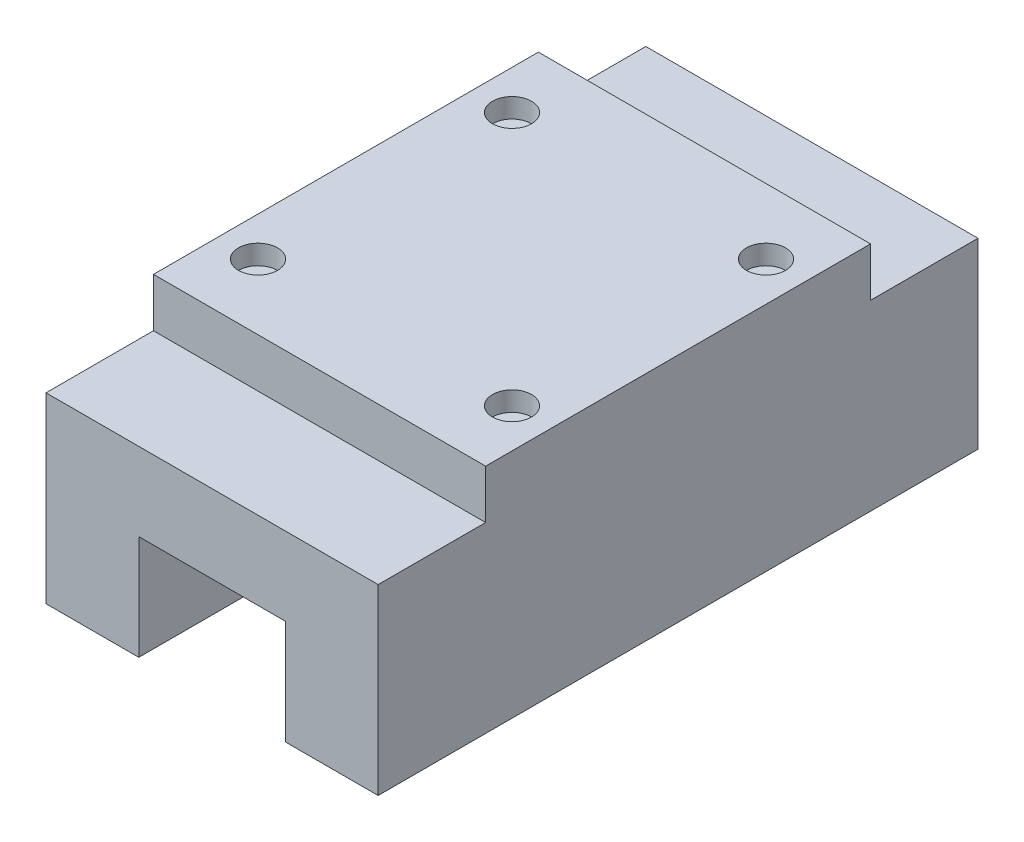
ISO-10303-21;
HEADER;
FILE_DESCRIPTION(('STEP AP214'),'2;1');
FILE_NAME('part.step','',(''),(''),'','','');
FILE_SCHEMA(('AUTOMOTIVE_DESIGN { 1 0 10303 214 1 1 1 1 }'));
ENDSEC;
DATA;
#1=APPLICATION_CONTEXT('core data for automotive mechanical design processes');
#2=APPLICATION_PROTOCOL_DEFINITION('international standard','automotive_design',2000,#1);
#3=PRODUCT_CONTEXT('',#1,'mechanical');
#4=PRODUCT('Part','Part','',(#3));
#5=PRODUCT_RELATED_PRODUCT_CATEGORY('part','',(#4));
#6=PRODUCT_DEFINITION_FORMATION('','',#4);
#7=PRODUCT_DEFINITION_CONTEXT('part definition',#1,'design');
#8=PRODUCT_DEFINITION('design','',#6,#7);
#9=PRODUCT_DEFINITION_SHAPE('','',#8);
#10=(LENGTH_UNIT() NAMED_UNIT(*) SI_UNIT(.MILLI.,.METRE.));
#11=(NAMED_UNIT(*) PLANE_ANGLE_UNIT() SI_UNIT($,.RADIAN.));
#12=(NAMED_UNIT(*) SI_UNIT($,.STERADIAN.) SOLID_ANGLE_UNIT());
#13=UNCERTAINTY_MEASURE_WITH_UNIT(LENGTH_MEASURE(1.E-05),#10,'distance_accuracy_value','');
#14=(GEOMETRIC_REPRESENTATION_CONTEXT(3) GLOBAL_UNCERTAINTY_ASSIGNED_CONTEXT((#13)) GLOBAL_UNIT_ASSIGNED_CONTEXT((#10,
#11,#12)) REPRESENTATION_CONTEXT('',''));
#15=CARTESIAN_POINT('',(0.,0.,0.));
#16=DIRECTION('',(0.,0.,1.));
#17=DIRECTION('',(1.,0.,0.));
#18=AXIS2_PLACEMENT_3D('',#15,#16,#17);
#19=CARTESIAN_POINT('',(0.,0.,61.4));
#20=DIRECTION('',(1.,0.,0.));
#21=DIRECTION('',(0.,0.,-1.));
#22=AXIS2_PLACEMENT_3D('',#19,#20,#21);
#23=PLANE('',#22);
#24=DIRECTION('',(0.,0.,-1.));
#25=VECTOR('',#24,1.);
#26=CARTESIAN_POINT('',(0.,23.7,61.4));
#27=LINE('',#26,#25);
#28=CARTESIAN_POINT('',(0.,23.7,50.4));
#29=VERTEX_POINT('',#28);
#30=CARTESIAN_POINT('',(0.,23.7,11.));
#31=VERTEX_POINT('',#30);
#32=EDGE_CURVE('E187',#29,#31,#27,.T.);
#33=ORIENTED_EDGE('',*,*,#32,.T.);
#34=DIRECTION('',(0.,-1.,0.));
#35=VECTOR('',#34,1.);
#36=CARTESIAN_POINT('',(0.,0.,11.));
#37=LINE('',#36,#35);
#38=CARTESIAN_POINT('',(0.,18.7,11.));
#39=VERTEX_POINT('',#38);
#40=EDGE_CURVE('E146',#31,#39,#37,.T.);
#41=ORIENTED_EDGE('',*,*,#40,.T.);
#42=DIRECTION('',(0.,0.,-1.));
#43=VECTOR('',#42,1.);
#44=CARTESIAN_POINT('',(0.,18.7,61.4));
#45=LINE('',#44,#43);
#46=CARTESIAN_POINT('',(0.,18.7,0.));
#47=VERTEX_POINT('',#46);
#48=EDGE_CURVE('E125',#39,#47,#45,.T.);
#49=ORIENTED_EDGE('',*,*,#48,.T.);
#50=DIRECTION('',(0.,-1.,0.));
#51=VECTOR('',#50,1.);
#52=CARTESIAN_POINT('',(0.,0.,0.));
#53=LINE('',#52,#51);
#54=CARTESIAN_POINT('',(0.,0.,0.));
#55=VERTEX_POINT('',#54);
#56=EDGE_CURVE('E159',#47,#55,#53,.T.);
#57=ORIENTED_EDGE('',*,*,#56,.T.);
#58=DIRECTION('',(0.,0.,-1.));
#59=VECTOR('',#58,1.);
#60=CARTESIAN_POINT('',(0.,0.,61.4));
#61=LINE('',#60,#59);
#62=CARTESIAN_POINT('',(0.,0.,61.4));
#63=VERTEX_POINT('',#62);
#64=EDGE_CURVE('E206',#63,#55,#61,.T.);
#65=ORIENTED_EDGE('',*,*,#64,.F.);
#66=DIRECTION('',(0.,-1.,0.));
#67=VECTOR('',#66,1.);
#68=CARTESIAN_POINT('',(0.,0.,61.4));
#69=LINE('',#68,#67);
#70=CARTESIAN_POINT('',(0.,18.7,61.4));
#71=VERTEX_POINT('',#70);
#72=EDGE_CURVE('E172',#71,#63,#69,.T.);
#73=ORIENTED_EDGE('',*,*,#72,.F.);
#74=DIRECTION('',(0.,0.,-1.));
#75=VECTOR('',#74,1.);
#76=CARTESIAN_POINT('',(0.,18.7,61.4));
#77=LINE('',#76,#75);
#78=CARTESIAN_POINT('',(0.,18.7,50.4));
#79=VERTEX_POINT('',#78);
#80=EDGE_CURVE('E56',#71,#79,#77,.T.);
#81=ORIENTED_EDGE('',*,*,#80,.T.);
#82=DIRECTION('',(0.,1.,0.));
#83=VECTOR('',#82,1.);
#84=CARTESIAN_POINT('',(0.,0.,50.4));
#85=LINE('',#84,#83);
#86=EDGE_CURVE('E156',#79,#29,#85,.T.);
#87=ORIENTED_EDGE('',*,*,#86,.T.);
#88=EDGE_LOOP('',(#33,#41,#49,#57,#65,#73,#81,#87));
#89=FACE_BOUND('',#88,.T.);
#90=ADVANCED_FACE('F34',(#89),#23,.F.);
#91=CARTESIAN_POINT('',(0.,0.,61.4));
#92=DIRECTION('',(0.,1.,0.));
#93=DIRECTION('',(0.,0.,1.));
#94=AXIS2_PLACEMENT_3D('',#91,#92,#93);
#95=PLANE('',#94);
#96=DIRECTION('',(1.,0.,0.));
#97=VECTOR('',#96,1.);
#98=CARTESIAN_POINT('',(0.,0.,0.));
#99=LINE('',#98,#97);
#100=CARTESIAN_POINT('',(9.5,0.,0.));
#101=VERTEX_POINT('',#100);
#102=EDGE_CURVE('E161',#55,#101,#99,.T.);
#103=ORIENTED_EDGE('',*,*,#102,.T.);
#104=DIRECTION('',(0.,0.,-1.));
#105=VECTOR('',#104,1.);
#106=CARTESIAN_POINT('',(9.5,0.,61.4));
#107=LINE('',#106,#105);
#108=CARTESIAN_POINT('',(9.5,0.,61.4));
#109=VERTEX_POINT('',#108);
#110=EDGE_CURVE('E203',#109,#101,#107,.T.);
#111=ORIENTED_EDGE('',*,*,#110,.F.);
#112=DIRECTION('',(1.,0.,0.));
#113=VECTOR('',#112,1.);
#114=CARTESIAN_POINT('',(0.,0.,61.4));
#115=LINE('',#114,#113);
#116=EDGE_CURVE('E174',#63,#109,#115,.T.);
#117=ORIENTED_EDGE('',*,*,#116,.F.);
#118=ORIENTED_EDGE('',*,*,#64,.T.);
#119=EDGE_LOOP('',(#103,#111,#117,#118));
#120=FACE_BOUND('',#119,.T.);
#121=ADVANCED_FACE('F224',(#120),#95,.F.);
#122=CARTESIAN_POINT('',(9.5,0.,61.4));
#123=DIRECTION('',(-1.,0.,0.));
#124=DIRECTION('',(0.,0.,1.));
#125=AXIS2_PLACEMENT_3D('',#122,#123,#124);
#126=PLANE('',#125);
#127=DIRECTION('',(0.,1.,0.));
#128=VECTOR('',#127,1.);
#129=CARTESIAN_POINT('',(9.5,0.,0.));
#130=LINE('',#129,#128);
#131=CARTESIAN_POINT('',(9.5,10.7,0.));
#132=VERTEX_POINT('',#131);
#133=EDGE_CURVE('E163',#101,#132,#130,.T.);
#134=ORIENTED_EDGE('',*,*,#133,.T.);
#135=DIRECTION('',(0.,0.,-1.));
#136=VECTOR('',#135,1.);
#137=CARTESIAN_POINT('',(9.5,10.7,61.4));
#138=LINE('',#137,#136);
#139=CARTESIAN_POINT('',(9.5,10.7,61.4));
#140=VERTEX_POINT('',#139);
#141=EDGE_CURVE('E200',#140,#132,#138,.T.);
#142=ORIENTED_EDGE('',*,*,#141,.F.);
#143=DIRECTION('',(0.,1.,0.));
#144=VECTOR('',#143,1.);
#145=CARTESIAN_POINT('',(9.5,0.,61.4));
#146=LINE('',#145,#144);
#147=EDGE_CURVE('E176',#109,#140,#146,.T.);
#148=ORIENTED_EDGE('',*,*,#147,.F.);
#149=ORIENTED_EDGE('',*,*,#110,.T.);
#150=EDGE_LOOP('',(#134,#142,#148,#149));
#151=FACE_BOUND('',#150,.T.);
#152=ADVANCED_FACE('F253',(#151),#126,.F.);
#153=CARTESIAN_POINT('',(9.5,10.7,61.4));
#154=DIRECTION('',(0.,1.,0.));
#155=DIRECTION('',(0.,0.,1.));
#156=AXIS2_PLACEMENT_3D('',#153,#154,#155);
#157=PLANE('',#156);
#158=DIRECTION('',(1.,0.,0.));
#159=VECTOR('',#158,1.);
#160=CARTESIAN_POINT('',(9.5,10.7,0.));
#161=LINE('',#160,#159);
#162=CARTESIAN_POINT('',(24.5,10.7,0.));
#163=VERTEX_POINT('',#162);
#164=EDGE_CURVE('E165',#132,#163,#161,.T.);
#165=ORIENTED_EDGE('',*,*,#164,.T.);
#166=DIRECTION('',(0.,0.,-1.));
#167=VECTOR('',#166,1.);
#168=CARTESIAN_POINT('',(24.5,10.7,61.4));
#169=LINE('',#168,#167);
#170=CARTESIAN_POINT('',(24.5,10.7,61.4));
#171=VERTEX_POINT('',#170);
#172=EDGE_CURVE('E197',#171,#163,#169,.T.);
#173=ORIENTED_EDGE('',*,*,#172,.F.);
#174=DIRECTION('',(1.,0.,0.));
#175=VECTOR('',#174,1.);
#176=CARTESIAN_POINT('',(9.5,10.7,61.4));
#177=LINE('',#176,#175);
#178=EDGE_CURVE('E178',#140,#171,#177,.T.);
#179=ORIENTED_EDGE('',*,*,#178,.F.);
#180=ORIENTED_EDGE('',*,*,#141,.T.);
#181=EDGE_LOOP('',(#165,#173,#179,#180));
#182=FACE_BOUND('',#181,.T.);
#183=ADVANCED_FACE('F257',(#182),#157,.F.);
#184=CARTESIAN_POINT('',(24.5,0.,61.4));
#185=DIRECTION('',(1.,0.,0.));
#186=DIRECTION('',(0.,1.,0.));
#187=AXIS2_PLACEMENT_3D('',#184,#185,#186);
#188=PLANE('',#187);
#189=DIRECTION('',(0.,-1.,0.));
#190=VECTOR('',#189,1.);
#191=CARTESIAN_POINT('',(24.5,0.,0.));
#192=LINE('',#191,#190);
#193=CARTESIAN_POINT('',(24.5,0.,0.));
#194=VERTEX_POINT('',#193);
#195=EDGE_CURVE('E167',#163,#194,#192,.T.);
#196=ORIENTED_EDGE('',*,*,#195,.T.);
#197=DIRECTION('',(0.,0.,-1.));
#198=VECTOR('',#197,1.);
#199=CARTESIAN_POINT('',(24.5,0.,61.4));
#200=LINE('',#199,#198);
#201=CARTESIAN_POINT('',(24.5,0.,61.4));
#202=VERTEX_POINT('',#201);
#203=EDGE_CURVE('E194',#202,#194,#200,.T.);
#204=ORIENTED_EDGE('',*,*,#203,.F.);
#205=DIRECTION('',(0.,-1.,0.));
#206=VECTOR('',#205,1.);
#207=CARTESIAN_POINT('',(24.5,0.,61.4));
#208=LINE('',#207,#206);
#209=EDGE_CURVE('E180',#171,#202,#208,.T.);
#210=ORIENTED_EDGE('',*,*,#209,.F.);
#211=ORIENTED_EDGE('',*,*,#172,.T.);
#212=EDGE_LOOP('',(#196,#204,#210,#211));
#213=FACE_BOUND('',#212,.T.);
#214=ADVANCED_FACE('F263',(#213),#188,.F.);
#215=CARTESIAN_POINT('',(24.5,0.,61.4));
#216=DIRECTION('',(0.,1.,0.));
#217=DIRECTION('',(0.,0.,1.));
#218=AXIS2_PLACEMENT_3D('',#215,#216,#217);
#219=PLANE('',#218);
#220=DIRECTION('',(1.,0.,0.));
#221=VECTOR('',#220,1.);
#222=CARTESIAN_POINT('',(24.5,0.,0.));
#223=LINE('',#222,#221);
#224=CARTESIAN_POINT('',(34.,0.,0.));
#225=VERTEX_POINT('',#224);
#226=EDGE_CURVE('E169',#194,#225,#223,.T.);
#227=ORIENTED_EDGE('',*,*,#226,.T.);
#228=DIRECTION('',(0.,0.,-1.));
#229=VECTOR('',#228,1.);
#230=CARTESIAN_POINT('',(34.,0.,61.4));
#231=LINE('',#230,#229);
#232=CARTESIAN_POINT('',(34.,0.,61.4));
#233=VERTEX_POINT('',#232);
#234=EDGE_CURVE('E192',#233,#225,#231,.T.);
#235=ORIENTED_EDGE('',*,*,#234,.F.);
#236=DIRECTION('',(1.,0.,0.));
#237=VECTOR('',#236,1.);
#238=CARTESIAN_POINT('',(24.5,0.,61.4));
#239=LINE('',#238,#237);
#240=EDGE_CURVE('E182',#202,#233,#239,.T.);
#241=ORIENTED_EDGE('',*,*,#240,.F.);
#242=ORIENTED_EDGE('',*,*,#203,.T.);
#243=EDGE_LOOP('',(#227,#235,#241,#242));
#244=FACE_BOUND('',#243,.T.);
#245=ADVANCED_FACE('F245',(#244),#219,.F.);
#246=CARTESIAN_POINT('',(34.,0.,61.4));
#247=DIRECTION('',(-1.,0.,0.));
#248=DIRECTION('',(0.,0.,1.));
#249=AXIS2_PLACEMENT_3D('',#246,#247,#248);
#250=PLANE('',#249);
#251=DIRECTION('',(0.,0.,-1.));
#252=VECTOR('',#251,1.);
#253=CARTESIAN_POINT('',(34.,18.7,11.));
#254=LINE('',#253,#252);
#255=CARTESIAN_POINT('',(34.,18.7,11.));
#256=VERTEX_POINT('',#255);
#257=CARTESIAN_POINT('',(34.,18.7,0.));
#258=VERTEX_POINT('',#257);
#259=EDGE_CURVE('E48',#256,#258,#254,.T.);
#260=ORIENTED_EDGE('',*,*,#259,.F.);
#261=DIRECTION('',(0.,-1.,0.));
#262=VECTOR('',#261,1.);
#263=CARTESIAN_POINT('',(34.,25.2566903302142,11.));
#264=LINE('',#263,#262);
#265=CARTESIAN_POINT('',(34.,23.7,11.));
#266=VERTEX_POINT('',#265);
#267=EDGE_CURVE('E130',#266,#256,#264,.T.);
#268=ORIENTED_EDGE('',*,*,#267,.F.);
#269=DIRECTION('',(0.,0.,-1.));
#270=VECTOR('',#269,1.);
#271=CARTESIAN_POINT('',(34.,23.7,61.4));
#272=LINE('',#271,#270);
#273=CARTESIAN_POINT('',(34.,23.7,50.4));
#274=VERTEX_POINT('',#273);
#275=EDGE_CURVE('E190',#274,#266,#272,.T.);
#276=ORIENTED_EDGE('',*,*,#275,.F.);
#277=DIRECTION('',(0.,1.,0.));
#278=VECTOR('',#277,1.);
#279=CARTESIAN_POINT('',(34.,24.2475959987093,50.4));
#280=LINE('',#279,#278);
#281=CARTESIAN_POINT('',(34.,18.7,50.4));
#282=VERTEX_POINT('',#281);
#283=EDGE_CURVE('E148',#282,#274,#280,.T.);
#284=ORIENTED_EDGE('',*,*,#283,.F.);
#285=DIRECTION('',(0.,0.,-1.));
#286=VECTOR('',#285,1.);
#287=CARTESIAN_POINT('',(34.,18.7,50.4));
#288=LINE('',#287,#286);
#289=CARTESIAN_POINT('',(34.,18.7,61.4));
#290=VERTEX_POINT('',#289);
#291=EDGE_CURVE('E150',#290,#282,#288,.T.);
#292=ORIENTED_EDGE('',*,*,#291,.F.);
#293=DIRECTION('',(0.,1.,0.));
#294=VECTOR('',#293,1.);
#295=CARTESIAN_POINT('',(34.,0.,61.4));
#296=LINE('',#295,#294);
#297=EDGE_CURVE('E184',#233,#290,#296,.T.);
#298=ORIENTED_EDGE('',*,*,#297,.F.);
#299=ORIENTED_EDGE('',*,*,#234,.T.);
#300=DIRECTION('',(0.,1.,0.));
#301=VECTOR('',#300,1.);
#302=CARTESIAN_POINT('',(34.,0.,0.));
#303=LINE('',#302,#301);
#304=EDGE_CURVE('E141',#225,#258,#303,.T.);
#305=ORIENTED_EDGE('',*,*,#304,.T.);
#306=EDGE_LOOP('',(#260,#268,#276,#284,#292,#298,#299,#305));
#307=FACE_BOUND('',#306,.T.);
#308=ADVANCED_FACE('F138',(#307),#250,.F.);
#309=CARTESIAN_POINT('',(0.,23.7,61.4));
#310=DIRECTION('',(0.,-1.,0.));
#311=DIRECTION('',(0.,0.,-1.));
#312=AXIS2_PLACEMENT_3D('',#309,#310,#311);
#313=PLANE('',#312);
#314=CARTESIAN_POINT('',(30.0002,23.7,43.6999));
#315=DIRECTION('',(0.,1.,0.));
#316=DIRECTION('',(0.,0.,1.));
#317=AXIS2_PLACEMENT_3D('',#314,#315,#316);
#318=CIRCLE('',#317,2.);
#319=CARTESIAN_POINT('',(30.0002,23.7,45.6999));
#320=VERTEX_POINT('',#319);
#321=EDGE_CURVE('E428',#320,#320,#318,.T.);
#322=ORIENTED_EDGE('',*,*,#321,.F.);
#323=EDGE_LOOP('',(#322));
#324=FACE_BOUND('',#323,.T.);
#325=CARTESIAN_POINT('',(4.0002,23.7,43.6999));
#326=DIRECTION('',(0.,1.,0.));
#327=DIRECTION('',(0.,0.,1.));
#328=AXIS2_PLACEMENT_3D('',#325,#326,#327);
#329=CIRCLE('',#328,2.);
#330=CARTESIAN_POINT('',(4.0002,23.7,45.6999));
#331=VERTEX_POINT('',#330);
#332=EDGE_CURVE('E427',#331,#331,#329,.T.);
#333=ORIENTED_EDGE('',*,*,#332,.F.);
#334=EDGE_LOOP('',(#333));
#335=FACE_BOUND('',#334,.T.);
#336=CARTESIAN_POINT('',(30.0002,23.7,17.6999));
#337=DIRECTION('',(0.,1.,0.));
#338=DIRECTION('',(0.,0.,1.));
#339=AXIS2_PLACEMENT_3D('',#336,#337,#338);
#340=CIRCLE('',#339,2.);
#341=CARTESIAN_POINT('',(30.0002,23.7,19.6999));
#342=VERTEX_POINT('',#341);
#343=EDGE_CURVE('E438',#342,#342,#340,.T.);
#344=ORIENTED_EDGE('',*,*,#343,.F.);
#345=EDGE_LOOP('',(#344));
#346=FACE_BOUND('',#345,.T.);
#347=CARTESIAN_POINT('',(4.0002,23.7,17.6999));
#348=DIRECTION('',(0.,1.,0.));
#349=DIRECTION('',(0.,0.,1.));
#350=AXIS2_PLACEMENT_3D('',#347,#348,#349);
#351=CIRCLE('',#350,2.);
#352=CARTESIAN_POINT('',(4.0002,23.7,19.6999));
#353=VERTEX_POINT('',#352);
#354=EDGE_CURVE('E444',#353,#353,#351,.T.);
#355=ORIENTED_EDGE('',*,*,#354,.F.);
#356=EDGE_LOOP('',(#355));
#357=FACE_BOUND('',#356,.T.);
#358=ORIENTED_EDGE('',*,*,#275,.T.);
#359=DIRECTION('',(-1.,0.,0.));
#360=VECTOR('',#359,1.);
#361=CARTESIAN_POINT('',(0.,23.7,11.));
#362=LINE('',#361,#360);
#363=EDGE_CURVE('E11',#266,#31,#362,.T.);
#364=ORIENTED_EDGE('',*,*,#363,.T.);
#365=ORIENTED_EDGE('',*,*,#32,.F.);
#366=DIRECTION('',(1.,0.,0.));
#367=VECTOR('',#366,1.);
#368=CARTESIAN_POINT('',(0.,23.7,50.4));
#369=LINE('',#368,#367);
#370=EDGE_CURVE('E211',#29,#274,#369,.T.);
#371=ORIENTED_EDGE('',*,*,#370,.T.);
#372=EDGE_LOOP('',(#358,#364,#365,#371));
#373=FACE_BOUND('',#372,.T.);
#374=ADVANCED_FACE('F236',(#324,#335,#346,#357,#373),#313,.F.);
#375=CARTESIAN_POINT('',(0.,23.7,61.4));
#376=DIRECTION('',(0.,0.,-1.));
#377=DIRECTION('',(-1.,0.,0.));
#378=AXIS2_PLACEMENT_3D('',#375,#376,#377);
#379=PLANE('',#378);
#380=ORIENTED_EDGE('',*,*,#297,.T.);
#381=DIRECTION('',(-1.,0.,0.));
#382=VECTOR('',#381,1.);
#383=CARTESIAN_POINT('',(0.,18.7,61.4));
#384=LINE('',#383,#382);
#385=EDGE_CURVE('E209',#290,#71,#384,.T.);
#386=ORIENTED_EDGE('',*,*,#385,.T.);
#387=ORIENTED_EDGE('',*,*,#72,.T.);
#388=ORIENTED_EDGE('',*,*,#116,.T.);
#389=ORIENTED_EDGE('',*,*,#147,.T.);
#390=ORIENTED_EDGE('',*,*,#178,.T.);
#391=ORIENTED_EDGE('',*,*,#209,.T.);
#392=ORIENTED_EDGE('',*,*,#240,.T.);
#393=EDGE_LOOP('',(#380,#386,#387,#388,#389,#390,#391,#392));
#394=FACE_BOUND('',#393,.T.);
#395=ADVANCED_FACE('F227',(#394),#379,.F.);
#396=CARTESIAN_POINT('',(0.,23.7,0.));
#397=DIRECTION('',(0.,0.,-1.));
#398=DIRECTION('',(-1.,0.,0.));
#399=AXIS2_PLACEMENT_3D('',#396,#397,#398);
#400=PLANE('',#399);
#401=DIRECTION('',(-1.,0.,0.));
#402=VECTOR('',#401,1.);
#403=CARTESIAN_POINT('',(0.,18.7,0.));
#404=LINE('',#403,#402);
#405=EDGE_CURVE('E41',#258,#47,#404,.T.);
#406=ORIENTED_EDGE('',*,*,#405,.F.);
#407=ORIENTED_EDGE('',*,*,#304,.F.);
#408=ORIENTED_EDGE('',*,*,#226,.F.);
#409=ORIENTED_EDGE('',*,*,#195,.F.);
#410=ORIENTED_EDGE('',*,*,#164,.F.);
#411=ORIENTED_EDGE('',*,*,#133,.F.);
#412=ORIENTED_EDGE('',*,*,#102,.F.);
#413=ORIENTED_EDGE('',*,*,#56,.F.);
#414=EDGE_LOOP('',(#406,#407,#408,#409,#410,#411,#412,#413));
#415=FACE_BOUND('',#414,.T.);
#416=ADVANCED_FACE('F218',(#415),#400,.T.);
#417=CARTESIAN_POINT('',(-27.4,24.2475959987093,50.4));
#418=DIRECTION('',(0.,0.,-1.));
#419=DIRECTION('',(-1.,0.,0.));
#420=AXIS2_PLACEMENT_3D('',#417,#418,#419);
#421=PLANE('',#420);
#422=DIRECTION('',(1.,0.,0.));
#423=VECTOR('',#422,1.);
#424=CARTESIAN_POINT('',(-27.4,18.7,50.4));
#425=LINE('',#424,#423);
#426=EDGE_CURVE('E153',#79,#282,#425,.T.);
#427=ORIENTED_EDGE('',*,*,#426,.T.);
#428=ORIENTED_EDGE('',*,*,#283,.T.);
#429=ORIENTED_EDGE('',*,*,#370,.F.);
#430=ORIENTED_EDGE('',*,*,#86,.F.);
#431=EDGE_LOOP('',(#427,#428,#429,#430));
#432=FACE_BOUND('',#431,.T.);
#433=ADVANCED_FACE('F233',(#432),#421,.F.);
#434=CARTESIAN_POINT('',(-27.4,18.7,50.4));
#435=DIRECTION('',(0.,-1.,0.));
#436=DIRECTION('',(0.,0.,-1.));
#437=AXIS2_PLACEMENT_3D('',#434,#435,#436);
#438=PLANE('',#437);
#439=ORIENTED_EDGE('',*,*,#385,.F.);
#440=ORIENTED_EDGE('',*,*,#291,.T.);
#441=ORIENTED_EDGE('',*,*,#426,.F.);
#442=ORIENTED_EDGE('',*,*,#80,.F.);
#443=EDGE_LOOP('',(#439,#440,#441,#442));
#444=FACE_BOUND('',#443,.T.);
#445=ADVANCED_FACE('F230',(#444),#438,.F.);
#446=CARTESIAN_POINT('',(-27.4,25.2566903302142,11.));
#447=DIRECTION('',(0.,0.,1.));
#448=DIRECTION('',(0.,-1.,0.));
#449=AXIS2_PLACEMENT_3D('',#446,#447,#448);
#450=PLANE('',#449);
#451=ORIENTED_EDGE('',*,*,#363,.F.);
#452=ORIENTED_EDGE('',*,*,#267,.T.);
#453=DIRECTION('',(1.,0.,0.));
#454=VECTOR('',#453,1.);
#455=CARTESIAN_POINT('',(-27.4,18.7,11.));
#456=LINE('',#455,#454);
#457=EDGE_CURVE('E121',#39,#256,#456,.T.);
#458=ORIENTED_EDGE('',*,*,#457,.F.);
#459=ORIENTED_EDGE('',*,*,#40,.F.);
#460=EDGE_LOOP('',(#451,#452,#458,#459));
#461=FACE_BOUND('',#460,.T.);
#462=ADVANCED_FACE('F131',(#461),#450,.F.);
#463=CARTESIAN_POINT('',(-27.4,18.7,11.));
#464=DIRECTION('',(0.,-1.,0.));
#465=DIRECTION('',(0.,0.,-1.));
#466=AXIS2_PLACEMENT_3D('',#463,#464,#465);
#467=PLANE('',#466);
#468=ORIENTED_EDGE('',*,*,#457,.T.);
#469=ORIENTED_EDGE('',*,*,#259,.T.);
#470=ORIENTED_EDGE('',*,*,#405,.T.);
#471=ORIENTED_EDGE('',*,*,#48,.F.);
#472=EDGE_LOOP('',(#468,#469,#470,#471));
#473=FACE_BOUND('',#472,.T.);
#474=ADVANCED_FACE('F123',(#473),#467,.F.);
#475=CARTESIAN_POINT('',(4.0002,21.7,17.6999));
#476=DIRECTION('',(0.,1.,0.));
#477=DIRECTION('',(0.,0.,1.));
#478=AXIS2_PLACEMENT_3D('',#475,#476,#477);
#479=CYLINDRICAL_SURFACE('',#478,2.);
#480=CARTESIAN_POINT('',(4.0002,21.7,17.6999));
#481=DIRECTION('',(0.,1.,0.));
#482=DIRECTION('',(0.,0.,1.));
#483=AXIS2_PLACEMENT_3D('',#480,#481,#482);
#484=CIRCLE('',#483,2.);
#485=CARTESIAN_POINT('',(4.0002,21.7,19.6999));
#486=VERTEX_POINT('',#485);
#487=EDGE_CURVE('E135',#486,#486,#484,.T.);
#488=ORIENTED_EDGE('',*,*,#487,.F.);
#489=EDGE_LOOP('',(#488));
#490=FACE_BOUND('',#489,.T.);
#491=ORIENTED_EDGE('',*,*,#354,.T.);
#492=EDGE_LOOP('',(#491));
#493=FACE_BOUND('',#492,.T.);
#494=ADVANCED_FACE('F337',(#490,#493),#479,.F.);
#495=CARTESIAN_POINT('',(4.0002,21.7,17.6999));
#496=DIRECTION('',(0.,1.,0.));
#497=DIRECTION('',(0.,0.,1.));
#498=AXIS2_PLACEMENT_3D('',#495,#496,#497);
#499=PLANE('',#498);
#500=ORIENTED_EDGE('',*,*,#487,.T.);
#501=EDGE_LOOP('',(#500));
#502=FACE_BOUND('',#501,.T.);
#503=ADVANCED_FACE('F350',(#502),#499,.T.);
#504=CARTESIAN_POINT('',(30.0002,21.7,17.6999));
#505=DIRECTION('',(0.,1.,0.));
#506=DIRECTION('',(0.,0.,1.));
#507=AXIS2_PLACEMENT_3D('',#504,#505,#506);
#508=CYLINDRICAL_SURFACE('',#507,2.);
#509=CARTESIAN_POINT('',(30.0002,21.7,17.6999));
#510=DIRECTION('',(0.,1.,0.));
#511=DIRECTION('',(0.,0.,1.));
#512=AXIS2_PLACEMENT_3D('',#509,#510,#511);
#513=CIRCLE('',#512,2.);
#514=CARTESIAN_POINT('',(30.0002,21.7,19.6999));
#515=VERTEX_POINT('',#514);
#516=EDGE_CURVE('E441',#515,#515,#513,.T.);
#517=ORIENTED_EDGE('',*,*,#516,.F.);
#518=EDGE_LOOP('',(#517));
#519=FACE_BOUND('',#518,.T.);
#520=ORIENTED_EDGE('',*,*,#343,.T.);
#521=EDGE_LOOP('',(#520));
#522=FACE_BOUND('',#521,.T.);
#523=ADVANCED_FACE('F360',(#519,#522),#508,.F.);
#524=CARTESIAN_POINT('',(30.0002,21.7,17.6999));
#525=DIRECTION('',(0.,1.,0.));
#526=DIRECTION('',(0.,0.,1.));
#527=AXIS2_PLACEMENT_3D('',#524,#525,#526);
#528=PLANE('',#527);
#529=ORIENTED_EDGE('',*,*,#516,.T.);
#530=EDGE_LOOP('',(#529));
#531=FACE_BOUND('',#530,.T.);
#532=ADVANCED_FACE('F370',(#531),#528,.T.);
#533=CARTESIAN_POINT('',(4.0002,21.7,43.6999));
#534=DIRECTION('',(0.,1.,0.));
#535=DIRECTION('',(0.,0.,1.));
#536=AXIS2_PLACEMENT_3D('',#533,#534,#535);
#537=CYLINDRICAL_SURFACE('',#536,2.);
#538=CARTESIAN_POINT('',(4.0002,21.7,43.6999));
#539=DIRECTION('',(0.,1.,0.));
#540=DIRECTION('',(0.,0.,1.));
#541=AXIS2_PLACEMENT_3D('',#538,#539,#540);
#542=CIRCLE('',#541,2.);
#543=CARTESIAN_POINT('',(4.0002,21.7,45.6999));
#544=VERTEX_POINT('',#543);
#545=EDGE_CURVE('E431',#544,#544,#542,.T.);
#546=ORIENTED_EDGE('',*,*,#545,.F.);
#547=EDGE_LOOP('',(#546));
#548=FACE_BOUND('',#547,.T.);
#549=ORIENTED_EDGE('',*,*,#332,.T.);
#550=EDGE_LOOP('',(#549));
#551=FACE_BOUND('',#550,.T.);
#552=ADVANCED_FACE('F380',(#548,#551),#537,.F.);
#553=CARTESIAN_POINT('',(4.0002,21.7,43.6999));
#554=DIRECTION('',(0.,1.,0.));
#555=DIRECTION('',(0.,0.,1.));
#556=AXIS2_PLACEMENT_3D('',#553,#554,#555);
#557=PLANE('',#556);
#558=ORIENTED_EDGE('',*,*,#545,.T.);
#559=EDGE_LOOP('',(#558));
#560=FACE_BOUND('',#559,.T.);
#561=ADVANCED_FACE('F390',(#560),#557,.T.);
#562=CARTESIAN_POINT('',(30.0002,21.7,43.6999));
#563=DIRECTION('',(0.,1.,0.));
#564=DIRECTION('',(0.,0.,1.));
#565=AXIS2_PLACEMENT_3D('',#562,#563,#564);
#566=CYLINDRICAL_SURFACE('',#565,2.);
#567=CARTESIAN_POINT('',(30.0002,21.7,43.6999));
#568=DIRECTION('',(0.,1.,0.));
#569=DIRECTION('',(0.,0.,1.));
#570=AXIS2_PLACEMENT_3D('',#567,#568,#569);
#571=CIRCLE('',#570,2.);
#572=CARTESIAN_POINT('',(30.0002,21.7,45.6999));
#573=VERTEX_POINT('',#572);
#574=EDGE_CURVE('E426',#573,#573,#571,.T.);
#575=ORIENTED_EDGE('',*,*,#574,.F.);
#576=EDGE_LOOP('',(#575));
#577=FACE_BOUND('',#576,.T.);
#578=ORIENTED_EDGE('',*,*,#321,.T.);
#579=EDGE_LOOP('',(#578));
#580=FACE_BOUND('',#579,.T.);
#581=ADVANCED_FACE('F400',(#577,#580),#566,.F.);
#582=CARTESIAN_POINT('',(30.0002,21.7,43.6999));
#583=DIRECTION('',(0.,1.,0.));
#584=DIRECTION('',(0.,0.,1.));
#585=AXIS2_PLACEMENT_3D('',#582,#583,#584);
#586=PLANE('',#585);
#587=ORIENTED_EDGE('',*,*,#574,.T.);
#588=EDGE_LOOP('',(#587));
#589=FACE_BOUND('',#588,.T.);
#590=ADVANCED_FACE('F410',(#589),#586,.T.);
#591=CLOSED_SHELL('',(#90,#121,#152,#183,#214,#245,#308,#374,#395,#416,#433,#445,#462,#474,#494,
#503,#523,#532,#552,#561,#581,#590));
#592=MANIFOLD_SOLID_BREP('B2',#591);
#593=ADVANCED_BREP_SHAPE_REPRESENTATION('',(#18,#592),#14);
#594=SHAPE_DEFINITION_REPRESENTATION(#9,#593);
ENDSEC;
END-ISO-10303-21;
